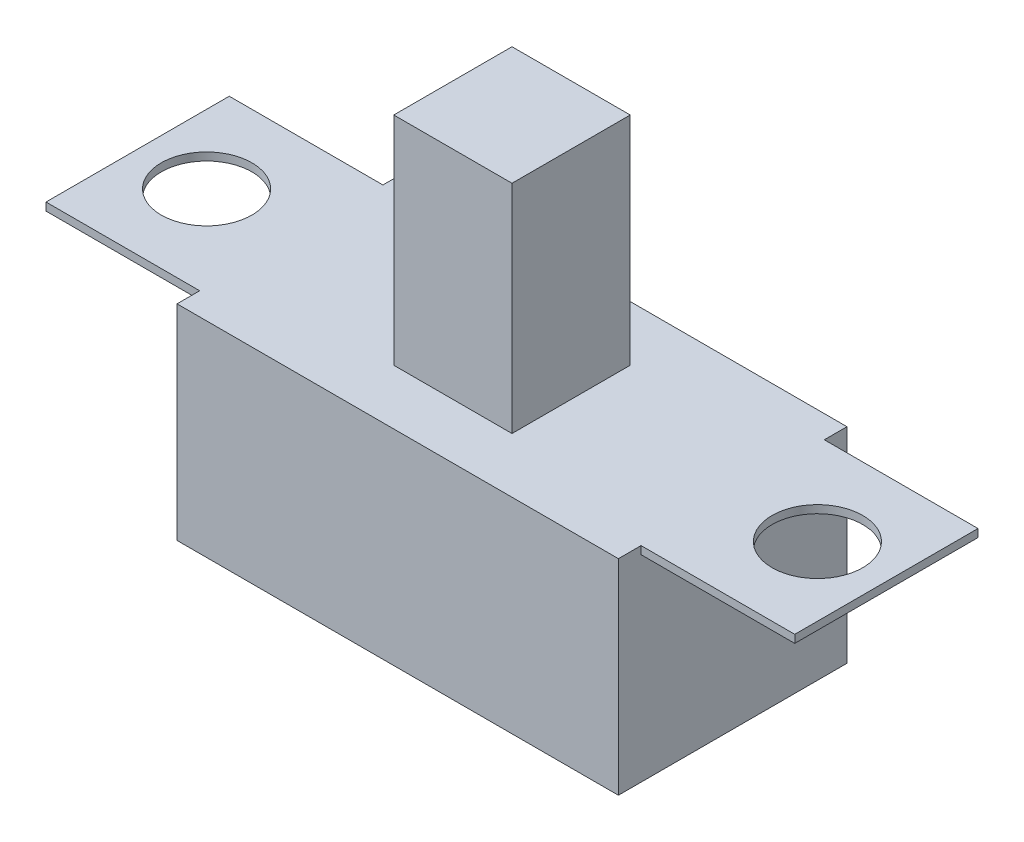
ISO-10303-21;
HEADER;
FILE_DESCRIPTION(('STEP AP214'),'2;1');
FILE_NAME('part.step','',(''),(''),'','','');
FILE_SCHEMA(('AUTOMOTIVE_DESIGN { 1 0 10303 214 1 1 1 1 }'));
ENDSEC;
DATA;
#1=APPLICATION_CONTEXT('core data for automotive mechanical design processes');
#2=APPLICATION_PROTOCOL_DEFINITION('international standard','automotive_design',2000,#1);
#3=PRODUCT_CONTEXT('',#1,'mechanical');
#4=PRODUCT('Part','Part','',(#3));
#5=PRODUCT_RELATED_PRODUCT_CATEGORY('part','',(#4));
#6=PRODUCT_DEFINITION_FORMATION('','',#4);
#7=PRODUCT_DEFINITION_CONTEXT('part definition',#1,'design');
#8=PRODUCT_DEFINITION('design','',#6,#7);
#9=PRODUCT_DEFINITION_SHAPE('','',#8);
#10=(LENGTH_UNIT() NAMED_UNIT(*) SI_UNIT(.MILLI.,.METRE.));
#11=(NAMED_UNIT(*) PLANE_ANGLE_UNIT() SI_UNIT($,.RADIAN.));
#12=(NAMED_UNIT(*) SI_UNIT($,.STERADIAN.) SOLID_ANGLE_UNIT());
#13=UNCERTAINTY_MEASURE_WITH_UNIT(LENGTH_MEASURE(1.E-05),#10,'distance_accuracy_value','');
#14=(GEOMETRIC_REPRESENTATION_CONTEXT(3) GLOBAL_UNCERTAINTY_ASSIGNED_CONTEXT((#13)) GLOBAL_UNIT_ASSIGNED_CONTEXT((#10,
#11,#12)) REPRESENTATION_CONTEXT('',''));
#15=CARTESIAN_POINT('',(0.,0.,0.));
#16=DIRECTION('',(0.,0.,1.));
#17=DIRECTION('',(1.,0.,0.));
#18=AXIS2_PLACEMENT_3D('',#15,#16,#17);
#19=CARTESIAN_POINT('',(0.,0.2,0.));
#20=DIRECTION('',(0.,-1.,0.));
#21=DIRECTION('',(0.,0.,-1.));
#22=AXIS2_PLACEMENT_3D('',#19,#20,#21);
#23=PLANE('',#22);
#24=CARTESIAN_POINT('',(-7.75,0.2,0.));
#25=DIRECTION('',(0.,1.,0.));
#26=DIRECTION('',(0.,0.,1.));
#27=AXIS2_PLACEMENT_3D('',#24,#25,#26);
#28=CIRCLE('',#27,1.15);
#29=CARTESIAN_POINT('',(-7.75,0.2,1.15));
#30=VERTEX_POINT('',#29);
#31=EDGE_CURVE('E189',#30,#30,#28,.T.);
#32=ORIENTED_EDGE('',*,*,#31,.F.);
#33=EDGE_LOOP('',(#32));
#34=FACE_BOUND('',#33,.T.);
#35=CARTESIAN_POINT('',(7.75,0.2,0.));
#36=DIRECTION('',(0.,1.,0.));
#37=DIRECTION('',(0.,0.,1.));
#38=AXIS2_PLACEMENT_3D('',#35,#36,#37);
#39=CIRCLE('',#38,1.15);
#40=CARTESIAN_POINT('',(7.75,0.2,1.15));
#41=VERTEX_POINT('',#40);
#42=EDGE_CURVE('E195',#41,#41,#39,.T.);
#43=ORIENTED_EDGE('',*,*,#42,.F.);
#44=EDGE_LOOP('',(#43));
#45=FACE_BOUND('',#44,.T.);
#46=DIRECTION('',(-1.,0.,0.));
#47=VECTOR('',#46,1.);
#48=CARTESIAN_POINT('',(5.6,0.2,-2.325));
#49=LINE('',#48,#47);
#50=CARTESIAN_POINT('',(9.5,0.2,-2.325));
#51=VERTEX_POINT('',#50);
#52=CARTESIAN_POINT('',(5.6,0.2,-2.325));
#53=VERTEX_POINT('',#52);
#54=EDGE_CURVE('E201',#51,#53,#49,.T.);
#55=ORIENTED_EDGE('',*,*,#54,.T.);
#56=DIRECTION('',(0.,0.,-1.));
#57=VECTOR('',#56,1.);
#58=CARTESIAN_POINT('',(5.6,0.2,-2.9));
#59=LINE('',#58,#57);
#60=CARTESIAN_POINT('',(5.6,0.2,-2.9));
#61=VERTEX_POINT('',#60);
#62=EDGE_CURVE('E204',#53,#61,#59,.T.);
#63=ORIENTED_EDGE('',*,*,#62,.T.);
#64=DIRECTION('',(-1.,0.,0.));
#65=VECTOR('',#64,1.);
#66=CARTESIAN_POINT('',(-5.6,0.2,-2.9));
#67=LINE('',#66,#65);
#68=CARTESIAN_POINT('',(-5.6,0.2,-2.9));
#69=VERTEX_POINT('',#68);
#70=EDGE_CURVE('E207',#61,#69,#67,.T.);
#71=ORIENTED_EDGE('',*,*,#70,.T.);
#72=DIRECTION('',(0.,0.,1.));
#73=VECTOR('',#72,1.);
#74=CARTESIAN_POINT('',(-5.6,0.2,-2.325));
#75=LINE('',#74,#73);
#76=CARTESIAN_POINT('',(-5.6,0.2,-2.325));
#77=VERTEX_POINT('',#76);
#78=EDGE_CURVE('E209',#69,#77,#75,.T.);
#79=ORIENTED_EDGE('',*,*,#78,.T.);
#80=DIRECTION('',(-1.,0.,0.));
#81=VECTOR('',#80,1.);
#82=CARTESIAN_POINT('',(-9.5,0.2,-2.325));
#83=LINE('',#82,#81);
#84=CARTESIAN_POINT('',(-9.5,0.2,-2.325));
#85=VERTEX_POINT('',#84);
#86=EDGE_CURVE('E211',#77,#85,#83,.T.);
#87=ORIENTED_EDGE('',*,*,#86,.T.);
#88=DIRECTION('',(0.,0.,1.));
#89=VECTOR('',#88,1.);
#90=CARTESIAN_POINT('',(-9.5,0.2,2.325));
#91=LINE('',#90,#89);
#92=CARTESIAN_POINT('',(-9.5,0.2,2.325));
#93=VERTEX_POINT('',#92);
#94=EDGE_CURVE('E213',#85,#93,#91,.T.);
#95=ORIENTED_EDGE('',*,*,#94,.T.);
#96=DIRECTION('',(1.,0.,0.));
#97=VECTOR('',#96,1.);
#98=CARTESIAN_POINT('',(-5.6,0.2,2.325));
#99=LINE('',#98,#97);
#100=CARTESIAN_POINT('',(-5.6,0.2,2.325));
#101=VERTEX_POINT('',#100);
#102=EDGE_CURVE('E215',#93,#101,#99,.T.);
#103=ORIENTED_EDGE('',*,*,#102,.T.);
#104=DIRECTION('',(0.,0.,1.));
#105=VECTOR('',#104,1.);
#106=CARTESIAN_POINT('',(-5.6,0.2,2.9));
#107=LINE('',#106,#105);
#108=CARTESIAN_POINT('',(-5.6,0.2,2.9));
#109=VERTEX_POINT('',#108);
#110=EDGE_CURVE('E217',#101,#109,#107,.T.);
#111=ORIENTED_EDGE('',*,*,#110,.T.);
#112=DIRECTION('',(1.,0.,0.));
#113=VECTOR('',#112,1.);
#114=CARTESIAN_POINT('',(5.6,0.2,2.9));
#115=LINE('',#114,#113);
#116=CARTESIAN_POINT('',(5.6,0.2,2.9));
#117=VERTEX_POINT('',#116);
#118=EDGE_CURVE('E219',#109,#117,#115,.T.);
#119=ORIENTED_EDGE('',*,*,#118,.T.);
#120=DIRECTION('',(0.,0.,-1.));
#121=VECTOR('',#120,1.);
#122=CARTESIAN_POINT('',(5.6,0.2,2.325));
#123=LINE('',#122,#121);
#124=CARTESIAN_POINT('',(5.6,0.2,2.325));
#125=VERTEX_POINT('',#124);
#126=EDGE_CURVE('E221',#117,#125,#123,.T.);
#127=ORIENTED_EDGE('',*,*,#126,.T.);
#128=DIRECTION('',(1.,0.,0.));
#129=VECTOR('',#128,1.);
#130=CARTESIAN_POINT('',(9.5,0.2,2.325));
#131=LINE('',#130,#129);
#132=CARTESIAN_POINT('',(9.5,0.2,2.325));
#133=VERTEX_POINT('',#132);
#134=EDGE_CURVE('E223',#125,#133,#131,.T.);
#135=ORIENTED_EDGE('',*,*,#134,.T.);
#136=DIRECTION('',(0.,0.,-1.));
#137=VECTOR('',#136,1.);
#138=CARTESIAN_POINT('',(9.5,0.2,-2.325));
#139=LINE('',#138,#137);
#140=EDGE_CURVE('E225',#133,#51,#139,.T.);
#141=ORIENTED_EDGE('',*,*,#140,.T.);
#142=EDGE_LOOP('',(#55,#63,#71,#79,#87,#95,#103,#111,#119,#127,#135,#141));
#143=FACE_BOUND('',#142,.T.);
#144=DIRECTION('',(0.,0.,-1.));
#145=VECTOR('',#144,1.);
#146=CARTESIAN_POINT('',(1.5,0.2,-1.5));
#147=LINE('',#146,#145);
#148=CARTESIAN_POINT('',(1.5,0.2,1.5));
#149=VERTEX_POINT('',#148);
#150=CARTESIAN_POINT('',(1.5,0.2,-1.5));
#151=VERTEX_POINT('',#150);
#152=EDGE_CURVE('E169',#149,#151,#147,.T.);
#153=ORIENTED_EDGE('',*,*,#152,.F.);
#154=DIRECTION('',(1.,0.,0.));
#155=VECTOR('',#154,1.);
#156=CARTESIAN_POINT('',(-1.5,0.2,1.5));
#157=LINE('',#156,#155);
#158=CARTESIAN_POINT('',(-1.5,0.2,1.5));
#159=VERTEX_POINT('',#158);
#160=EDGE_CURVE('E166',#159,#149,#157,.T.);
#161=ORIENTED_EDGE('',*,*,#160,.F.);
#162=DIRECTION('',(0.,0.,1.));
#163=VECTOR('',#162,1.);
#164=CARTESIAN_POINT('',(-1.5,0.2,-1.5));
#165=LINE('',#164,#163);
#166=CARTESIAN_POINT('',(-1.5,0.2,-1.5));
#167=VERTEX_POINT('',#166);
#168=EDGE_CURVE('E57',#167,#159,#165,.T.);
#169=ORIENTED_EDGE('',*,*,#168,.F.);
#170=DIRECTION('',(-1.,0.,0.));
#171=VECTOR('',#170,1.);
#172=CARTESIAN_POINT('',(-1.5,0.2,-1.5));
#173=LINE('',#172,#171);
#174=EDGE_CURVE('E52',#151,#167,#173,.T.);
#175=ORIENTED_EDGE('',*,*,#174,.F.);
#176=EDGE_LOOP('',(#153,#161,#169,#175));
#177=FACE_BOUND('',#176,.T.);
#178=ADVANCED_FACE('F35',(#34,#45,#143,#177),#23,.F.);
#179=CARTESIAN_POINT('',(0.,0.,0.));
#180=DIRECTION('',(0.,-1.,0.));
#181=DIRECTION('',(0.,0.,-1.));
#182=AXIS2_PLACEMENT_3D('',#179,#180,#181);
#183=PLANE('',#182);
#184=DIRECTION('',(0.,0.,-1.));
#185=VECTOR('',#184,1.);
#186=CARTESIAN_POINT('',(-5.6,0.,2.9));
#187=LINE('',#186,#185);
#188=CARTESIAN_POINT('',(-5.6,0.,2.325));
#189=VERTEX_POINT('',#188);
#190=CARTESIAN_POINT('',(-5.6,0.,-2.325));
#191=VERTEX_POINT('',#190);
#192=EDGE_CURVE('E11',#189,#191,#187,.T.);
#193=ORIENTED_EDGE('',*,*,#192,.F.);
#194=DIRECTION('',(1.,0.,0.));
#195=VECTOR('',#194,1.);
#196=CARTESIAN_POINT('',(-5.6,0.,2.325));
#197=LINE('',#196,#195);
#198=CARTESIAN_POINT('',(-9.5,0.,2.325));
#199=VERTEX_POINT('',#198);
#200=EDGE_CURVE('E234',#199,#189,#197,.T.);
#201=ORIENTED_EDGE('',*,*,#200,.F.);
#202=DIRECTION('',(0.,0.,1.));
#203=VECTOR('',#202,1.);
#204=CARTESIAN_POINT('',(-9.5,0.,2.325));
#205=LINE('',#204,#203);
#206=CARTESIAN_POINT('',(-9.5,0.,-2.325));
#207=VERTEX_POINT('',#206);
#208=EDGE_CURVE('E232',#207,#199,#205,.T.);
#209=ORIENTED_EDGE('',*,*,#208,.F.);
#210=DIRECTION('',(-1.,0.,0.));
#211=VECTOR('',#210,1.);
#212=CARTESIAN_POINT('',(-9.5,0.,-2.325));
#213=LINE('',#212,#211);
#214=EDGE_CURVE('E230',#191,#207,#213,.T.);
#215=ORIENTED_EDGE('',*,*,#214,.F.);
#216=EDGE_LOOP('',(#193,#201,#209,#215));
#217=FACE_BOUND('',#216,.T.);
#218=CARTESIAN_POINT('',(-7.75,0.,0.));
#219=DIRECTION('',(0.,1.,0.));
#220=DIRECTION('',(0.,0.,1.));
#221=AXIS2_PLACEMENT_3D('',#218,#219,#220);
#222=CIRCLE('',#221,1.15);
#223=CARTESIAN_POINT('',(-7.75,0.,1.15));
#224=VERTEX_POINT('',#223);
#225=EDGE_CURVE('E186',#224,#224,#222,.T.);
#226=ORIENTED_EDGE('',*,*,#225,.T.);
#227=EDGE_LOOP('',(#226));
#228=FACE_BOUND('',#227,.T.);
#229=ADVANCED_FACE('F320',(#217,#228),#183,.T.);
#230=DIRECTION('',(0.,0.,1.));
#231=VECTOR('',#230,1.);
#232=CARTESIAN_POINT('',(5.6,0.,2.9));
#233=LINE('',#232,#231);
#234=CARTESIAN_POINT('',(5.6,0.,-2.325));
#235=VERTEX_POINT('',#234);
#236=CARTESIAN_POINT('',(5.6,0.,2.325));
#237=VERTEX_POINT('',#236);
#238=EDGE_CURVE('E44',#235,#237,#233,.T.);
#239=ORIENTED_EDGE('',*,*,#238,.F.);
#240=DIRECTION('',(-1.,0.,0.));
#241=VECTOR('',#240,1.);
#242=CARTESIAN_POINT('',(5.6,0.,-2.325));
#243=LINE('',#242,#241);
#244=CARTESIAN_POINT('',(9.5,0.,-2.325));
#245=VERTEX_POINT('',#244);
#246=EDGE_CURVE('E198',#245,#235,#243,.T.);
#247=ORIENTED_EDGE('',*,*,#246,.F.);
#248=DIRECTION('',(0.,0.,-1.));
#249=VECTOR('',#248,1.);
#250=CARTESIAN_POINT('',(9.5,0.,-2.325));
#251=LINE('',#250,#249);
#252=CARTESIAN_POINT('',(9.5,0.,2.325));
#253=VERTEX_POINT('',#252);
#254=EDGE_CURVE('E205',#253,#245,#251,.T.);
#255=ORIENTED_EDGE('',*,*,#254,.F.);
#256=DIRECTION('',(1.,0.,0.));
#257=VECTOR('',#256,1.);
#258=CARTESIAN_POINT('',(9.5,0.,2.325));
#259=LINE('',#258,#257);
#260=EDGE_CURVE('E237',#237,#253,#259,.T.);
#261=ORIENTED_EDGE('',*,*,#260,.F.);
#262=EDGE_LOOP('',(#239,#247,#255,#261));
#263=FACE_BOUND('',#262,.T.);
#264=CARTESIAN_POINT('',(7.75,0.,0.));
#265=DIRECTION('',(0.,1.,0.));
#266=DIRECTION('',(0.,0.,1.));
#267=AXIS2_PLACEMENT_3D('',#264,#265,#266);
#268=CIRCLE('',#267,1.15);
#269=CARTESIAN_POINT('',(7.75,0.,1.15));
#270=VERTEX_POINT('',#269);
#271=EDGE_CURVE('E192',#270,#270,#268,.T.);
#272=ORIENTED_EDGE('',*,*,#271,.T.);
#273=EDGE_LOOP('',(#272));
#274=FACE_BOUND('',#273,.T.);
#275=ADVANCED_FACE('F281',(#263,#274),#183,.T.);
#276=CARTESIAN_POINT('',(5.6,0.2,-2.325));
#277=DIRECTION('',(0.,0.,1.));
#278=DIRECTION('',(1.,0.,0.));
#279=AXIS2_PLACEMENT_3D('',#276,#277,#278);
#280=PLANE('',#279);
#281=ORIENTED_EDGE('',*,*,#246,.T.);
#282=DIRECTION('',(0.,-1.,0.));
#283=VECTOR('',#282,1.);
#284=CARTESIAN_POINT('',(5.6,0.2,-2.325));
#285=LINE('',#284,#283);
#286=EDGE_CURVE('E39',#53,#235,#285,.T.);
#287=ORIENTED_EDGE('',*,*,#286,.F.);
#288=ORIENTED_EDGE('',*,*,#54,.F.);
#289=DIRECTION('',(0.,-1.,0.));
#290=VECTOR('',#289,1.);
#291=CARTESIAN_POINT('',(9.5,0.2,-2.325));
#292=LINE('',#291,#290);
#293=EDGE_CURVE('E227',#51,#245,#292,.T.);
#294=ORIENTED_EDGE('',*,*,#293,.T.);
#295=EDGE_LOOP('',(#281,#287,#288,#294));
#296=FACE_BOUND('',#295,.T.);
#297=ADVANCED_FACE('F37',(#296),#280,.F.);
#298=CARTESIAN_POINT('',(-5.6,0.2,-2.9));
#299=DIRECTION('',(0.,0.,1.));
#300=DIRECTION('',(1.,0.,0.));
#301=AXIS2_PLACEMENT_3D('',#298,#299,#300);
#302=PLANE('',#301);
#303=DIRECTION('',(0.,-1.,0.));
#304=VECTOR('',#303,1.);
#305=CARTESIAN_POINT('',(5.6,0.2,-2.9));
#306=LINE('',#305,#304);
#307=CARTESIAN_POINT('',(5.6,-5.,-2.9));
#308=VERTEX_POINT('',#307);
#309=EDGE_CURVE('E265',#61,#308,#306,.T.);
#310=ORIENTED_EDGE('',*,*,#309,.T.);
#311=DIRECTION('',(1.,0.,0.));
#312=VECTOR('',#311,1.);
#313=CARTESIAN_POINT('',(-5.6,-5.,-2.9));
#314=LINE('',#313,#312);
#315=CARTESIAN_POINT('',(-5.6,-5.,-2.9));
#316=VERTEX_POINT('',#315);
#317=EDGE_CURVE('E173',#316,#308,#314,.T.);
#318=ORIENTED_EDGE('',*,*,#317,.F.);
#319=DIRECTION('',(0.,-1.,0.));
#320=VECTOR('',#319,1.);
#321=CARTESIAN_POINT('',(-5.6,0.2,-2.9));
#322=LINE('',#321,#320);
#323=EDGE_CURVE('E264',#69,#316,#322,.T.);
#324=ORIENTED_EDGE('',*,*,#323,.F.);
#325=ORIENTED_EDGE('',*,*,#70,.F.);
#326=EDGE_LOOP('',(#310,#318,#324,#325));
#327=FACE_BOUND('',#326,.T.);
#328=ADVANCED_FACE('F309',(#327),#302,.F.);
#329=CARTESIAN_POINT('',(-9.5,0.2,-2.325));
#330=DIRECTION('',(0.,0.,1.));
#331=DIRECTION('',(1.,0.,0.));
#332=AXIS2_PLACEMENT_3D('',#329,#330,#331);
#333=PLANE('',#332);
#334=ORIENTED_EDGE('',*,*,#214,.T.);
#335=DIRECTION('',(0.,-1.,0.));
#336=VECTOR('',#335,1.);
#337=CARTESIAN_POINT('',(-9.5,0.2,-2.325));
#338=LINE('',#337,#336);
#339=EDGE_CURVE('E258',#85,#207,#338,.T.);
#340=ORIENTED_EDGE('',*,*,#339,.F.);
#341=ORIENTED_EDGE('',*,*,#86,.F.);
#342=DIRECTION('',(0.,-1.,0.));
#343=VECTOR('',#342,1.);
#344=CARTESIAN_POINT('',(-5.6,0.2,-2.325));
#345=LINE('',#344,#343);
#346=EDGE_CURVE('E261',#77,#191,#345,.T.);
#347=ORIENTED_EDGE('',*,*,#346,.T.);
#348=EDGE_LOOP('',(#334,#340,#341,#347));
#349=FACE_BOUND('',#348,.T.);
#350=ADVANCED_FACE('F311',(#349),#333,.F.);
#351=CARTESIAN_POINT('',(-9.5,0.2,2.325));
#352=DIRECTION('',(1.,0.,0.));
#353=DIRECTION('',(0.,0.,-1.));
#354=AXIS2_PLACEMENT_3D('',#351,#352,#353);
#355=PLANE('',#354);
#356=ORIENTED_EDGE('',*,*,#208,.T.);
#357=DIRECTION('',(0.,-1.,0.));
#358=VECTOR('',#357,1.);
#359=CARTESIAN_POINT('',(-9.5,0.2,2.325));
#360=LINE('',#359,#358);
#361=EDGE_CURVE('E255',#93,#199,#360,.T.);
#362=ORIENTED_EDGE('',*,*,#361,.F.);
#363=ORIENTED_EDGE('',*,*,#94,.F.);
#364=ORIENTED_EDGE('',*,*,#339,.T.);
#365=EDGE_LOOP('',(#356,#362,#363,#364));
#366=FACE_BOUND('',#365,.T.);
#367=ADVANCED_FACE('F316',(#366),#355,.F.);
#368=CARTESIAN_POINT('',(-5.6,0.2,2.325));
#369=DIRECTION('',(0.,0.,-1.));
#370=DIRECTION('',(-1.,0.,0.));
#371=AXIS2_PLACEMENT_3D('',#368,#369,#370);
#372=PLANE('',#371);
#373=ORIENTED_EDGE('',*,*,#200,.T.);
#374=DIRECTION('',(0.,-1.,0.));
#375=VECTOR('',#374,1.);
#376=CARTESIAN_POINT('',(-5.6,0.2,2.325));
#377=LINE('',#376,#375);
#378=EDGE_CURVE('E252',#101,#189,#377,.T.);
#379=ORIENTED_EDGE('',*,*,#378,.F.);
#380=ORIENTED_EDGE('',*,*,#102,.F.);
#381=ORIENTED_EDGE('',*,*,#361,.T.);
#382=EDGE_LOOP('',(#373,#379,#380,#381));
#383=FACE_BOUND('',#382,.T.);
#384=ADVANCED_FACE('F345',(#383),#372,.F.);
#385=CARTESIAN_POINT('',(-5.6,0.2,2.9));
#386=DIRECTION('',(1.,0.,0.));
#387=DIRECTION('',(0.,0.,-1.));
#388=AXIS2_PLACEMENT_3D('',#385,#386,#387);
#389=PLANE('',#388);
#390=ORIENTED_EDGE('',*,*,#378,.T.);
#391=ORIENTED_EDGE('',*,*,#192,.T.);
#392=ORIENTED_EDGE('',*,*,#346,.F.);
#393=ORIENTED_EDGE('',*,*,#78,.F.);
#394=ORIENTED_EDGE('',*,*,#323,.T.);
#395=DIRECTION('',(0.,0.,-1.));
#396=VECTOR('',#395,1.);
#397=CARTESIAN_POINT('',(-5.6,-5.,2.9));
#398=LINE('',#397,#396);
#399=CARTESIAN_POINT('',(-5.6,-5.,2.9));
#400=VERTEX_POINT('',#399);
#401=EDGE_CURVE('E170',#400,#316,#398,.T.);
#402=ORIENTED_EDGE('',*,*,#401,.F.);
#403=DIRECTION('',(0.,-1.,0.));
#404=VECTOR('',#403,1.);
#405=CARTESIAN_POINT('',(-5.6,0.2,2.9));
#406=LINE('',#405,#404);
#407=EDGE_CURVE('E250',#109,#400,#406,.T.);
#408=ORIENTED_EDGE('',*,*,#407,.F.);
#409=ORIENTED_EDGE('',*,*,#110,.F.);
#410=EDGE_LOOP('',(#390,#391,#392,#393,#394,#402,#408,#409));
#411=FACE_BOUND('',#410,.T.);
#412=ADVANCED_FACE('F305',(#411),#389,.F.);
#413=CARTESIAN_POINT('',(5.6,0.2,2.9));
#414=DIRECTION('',(0.,0.,-1.));
#415=DIRECTION('',(-1.,0.,0.));
#416=AXIS2_PLACEMENT_3D('',#413,#414,#415);
#417=PLANE('',#416);
#418=ORIENTED_EDGE('',*,*,#407,.T.);
#419=DIRECTION('',(-1.,0.,0.));
#420=VECTOR('',#419,1.);
#421=CARTESIAN_POINT('',(-5.6,-5.,2.9));
#422=LINE('',#421,#420);
#423=CARTESIAN_POINT('',(5.6,-5.,2.9));
#424=VERTEX_POINT('',#423);
#425=EDGE_CURVE('E184',#424,#400,#422,.T.);
#426=ORIENTED_EDGE('',*,*,#425,.F.);
#427=DIRECTION('',(0.,-1.,0.));
#428=VECTOR('',#427,1.);
#429=CARTESIAN_POINT('',(5.6,0.2,2.9));
#430=LINE('',#429,#428);
#431=EDGE_CURVE('E248',#117,#424,#430,.T.);
#432=ORIENTED_EDGE('',*,*,#431,.F.);
#433=ORIENTED_EDGE('',*,*,#118,.F.);
#434=EDGE_LOOP('',(#418,#426,#432,#433));
#435=FACE_BOUND('',#434,.T.);
#436=ADVANCED_FACE('F301',(#435),#417,.F.);
#437=CARTESIAN_POINT('',(5.6,0.2,2.325));
#438=DIRECTION('',(-1.,0.,0.));
#439=DIRECTION('',(0.,0.,1.));
#440=AXIS2_PLACEMENT_3D('',#437,#438,#439);
#441=PLANE('',#440);
#442=ORIENTED_EDGE('',*,*,#431,.T.);
#443=DIRECTION('',(0.,0.,1.));
#444=VECTOR('',#443,1.);
#445=CARTESIAN_POINT('',(5.6,-5.,2.9));
#446=LINE('',#445,#444);
#447=EDGE_CURVE('E181',#308,#424,#446,.T.);
#448=ORIENTED_EDGE('',*,*,#447,.F.);
#449=ORIENTED_EDGE('',*,*,#309,.F.);
#450=ORIENTED_EDGE('',*,*,#62,.F.);
#451=ORIENTED_EDGE('',*,*,#286,.T.);
#452=ORIENTED_EDGE('',*,*,#238,.T.);
#453=DIRECTION('',(0.,-1.,0.));
#454=VECTOR('',#453,1.);
#455=CARTESIAN_POINT('',(5.6,0.2,2.325));
#456=LINE('',#455,#454);
#457=EDGE_CURVE('E245',#125,#237,#456,.T.);
#458=ORIENTED_EDGE('',*,*,#457,.F.);
#459=ORIENTED_EDGE('',*,*,#126,.F.);
#460=EDGE_LOOP('',(#442,#448,#449,#450,#451,#452,#458,#459));
#461=FACE_BOUND('',#460,.T.);
#462=ADVANCED_FACE('F273',(#461),#441,.F.);
#463=CARTESIAN_POINT('',(9.5,0.2,2.325));
#464=DIRECTION('',(0.,0.,-1.));
#465=DIRECTION('',(-1.,0.,0.));
#466=AXIS2_PLACEMENT_3D('',#463,#464,#465);
#467=PLANE('',#466);
#468=ORIENTED_EDGE('',*,*,#260,.T.);
#469=DIRECTION('',(0.,-1.,0.));
#470=VECTOR('',#469,1.);
#471=CARTESIAN_POINT('',(9.5,0.2,2.325));
#472=LINE('',#471,#470);
#473=EDGE_CURVE('E242',#133,#253,#472,.T.);
#474=ORIENTED_EDGE('',*,*,#473,.F.);
#475=ORIENTED_EDGE('',*,*,#134,.F.);
#476=ORIENTED_EDGE('',*,*,#457,.T.);
#477=EDGE_LOOP('',(#468,#474,#475,#476));
#478=FACE_BOUND('',#477,.T.);
#479=ADVANCED_FACE('F286',(#478),#467,.F.);
#480=CARTESIAN_POINT('',(9.5,0.2,-2.325));
#481=DIRECTION('',(-1.,0.,0.));
#482=DIRECTION('',(0.,0.,1.));
#483=AXIS2_PLACEMENT_3D('',#480,#481,#482);
#484=PLANE('',#483);
#485=ORIENTED_EDGE('',*,*,#254,.T.);
#486=ORIENTED_EDGE('',*,*,#293,.F.);
#487=ORIENTED_EDGE('',*,*,#140,.F.);
#488=ORIENTED_EDGE('',*,*,#473,.T.);
#489=EDGE_LOOP('',(#485,#486,#487,#488));
#490=FACE_BOUND('',#489,.T.);
#491=ADVANCED_FACE('F290',(#490),#484,.F.);
#492=CARTESIAN_POINT('',(7.75,0.2,0.));
#493=DIRECTION('',(0.,-1.,0.));
#494=DIRECTION('',(0.,0.,-1.));
#495=AXIS2_PLACEMENT_3D('',#492,#493,#494);
#496=CYLINDRICAL_SURFACE('',#495,1.15);
#497=ORIENTED_EDGE('',*,*,#42,.T.);
#498=EDGE_LOOP('',(#497));
#499=FACE_BOUND('',#498,.T.);
#500=ORIENTED_EDGE('',*,*,#271,.F.);
#501=EDGE_LOOP('',(#500));
#502=FACE_BOUND('',#501,.T.);
#503=ADVANCED_FACE('F331',(#499,#502),#496,.F.);
#504=CARTESIAN_POINT('',(-7.75,0.2,0.));
#505=DIRECTION('',(0.,-1.,0.));
#506=DIRECTION('',(0.,0.,-1.));
#507=AXIS2_PLACEMENT_3D('',#504,#505,#506);
#508=CYLINDRICAL_SURFACE('',#507,1.15);
#509=ORIENTED_EDGE('',*,*,#31,.T.);
#510=EDGE_LOOP('',(#509));
#511=FACE_BOUND('',#510,.T.);
#512=ORIENTED_EDGE('',*,*,#225,.F.);
#513=EDGE_LOOP('',(#512));
#514=FACE_BOUND('',#513,.T.);
#515=ADVANCED_FACE('F365',(#511,#514),#508,.F.);
#516=CARTESIAN_POINT('',(0.,-5.,0.));
#517=DIRECTION('',(0.,-1.,0.));
#518=DIRECTION('',(0.,0.,-1.));
#519=AXIS2_PLACEMENT_3D('',#516,#517,#518);
#520=PLANE('',#519);
#521=ORIENTED_EDGE('',*,*,#401,.T.);
#522=ORIENTED_EDGE('',*,*,#317,.T.);
#523=ORIENTED_EDGE('',*,*,#447,.T.);
#524=ORIENTED_EDGE('',*,*,#425,.T.);
#525=EDGE_LOOP('',(#521,#522,#523,#524));
#526=FACE_BOUND('',#525,.T.);
#527=ADVANCED_FACE('F299',(#526),#520,.T.);
#528=CARTESIAN_POINT('',(1.5,5.7,-1.5));
#529=DIRECTION('',(-1.,0.,0.));
#530=DIRECTION('',(0.,0.,1.));
#531=AXIS2_PLACEMENT_3D('',#528,#529,#530);
#532=PLANE('',#531);
#533=ORIENTED_EDGE('',*,*,#152,.T.);
#534=DIRECTION('',(0.,-1.,0.));
#535=VECTOR('',#534,1.);
#536=CARTESIAN_POINT('',(1.5,5.7,-1.5));
#537=LINE('',#536,#535);
#538=CARTESIAN_POINT('',(1.5,5.7,-1.5));
#539=VERTEX_POINT('',#538);
#540=EDGE_CURVE('E150',#539,#151,#537,.T.);
#541=ORIENTED_EDGE('',*,*,#540,.F.);
#542=DIRECTION('',(0.,0.,-1.));
#543=VECTOR('',#542,1.);
#544=CARTESIAN_POINT('',(1.5,5.7,-1.5));
#545=LINE('',#544,#543);
#546=CARTESIAN_POINT('',(1.5,5.7,1.5));
#547=VERTEX_POINT('',#546);
#548=EDGE_CURVE('E157',#547,#539,#545,.T.);
#549=ORIENTED_EDGE('',*,*,#548,.F.);
#550=DIRECTION('',(0.,-1.,0.));
#551=VECTOR('',#550,1.);
#552=CARTESIAN_POINT('',(1.5,5.7,1.5));
#553=LINE('',#552,#551);
#554=EDGE_CURVE('E526',#547,#149,#553,.T.);
#555=ORIENTED_EDGE('',*,*,#554,.T.);
#556=EDGE_LOOP('',(#533,#541,#549,#555));
#557=FACE_BOUND('',#556,.T.);
#558=ADVANCED_FACE('F168',(#557),#532,.F.);
#559=CARTESIAN_POINT('',(-1.5,5.7,-1.5));
#560=DIRECTION('',(0.,0.,1.));
#561=DIRECTION('',(1.,0.,0.));
#562=AXIS2_PLACEMENT_3D('',#559,#560,#561);
#563=PLANE('',#562);
#564=ORIENTED_EDGE('',*,*,#174,.T.);
#565=DIRECTION('',(0.,-1.,0.));
#566=VECTOR('',#565,1.);
#567=CARTESIAN_POINT('',(-1.5,5.7,-1.5));
#568=LINE('',#567,#566);
#569=CARTESIAN_POINT('',(-1.5,5.7,-1.5));
#570=VERTEX_POINT('',#569);
#571=EDGE_CURVE('E153',#570,#167,#568,.T.);
#572=ORIENTED_EDGE('',*,*,#571,.F.);
#573=DIRECTION('',(-1.,0.,0.));
#574=VECTOR('',#573,1.);
#575=CARTESIAN_POINT('',(-1.5,5.7,-1.5));
#576=LINE('',#575,#574);
#577=EDGE_CURVE('E146',#539,#570,#576,.T.);
#578=ORIENTED_EDGE('',*,*,#577,.F.);
#579=ORIENTED_EDGE('',*,*,#540,.T.);
#580=EDGE_LOOP('',(#564,#572,#578,#579));
#581=FACE_BOUND('',#580,.T.);
#582=ADVANCED_FACE('F148',(#581),#563,.F.);
#583=CARTESIAN_POINT('',(-1.5,5.7,-1.5));
#584=DIRECTION('',(1.,0.,0.));
#585=DIRECTION('',(0.,0.,-1.));
#586=AXIS2_PLACEMENT_3D('',#583,#584,#585);
#587=PLANE('',#586);
#588=ORIENTED_EDGE('',*,*,#168,.T.);
#589=DIRECTION('',(0.,-1.,0.));
#590=VECTOR('',#589,1.);
#591=CARTESIAN_POINT('',(-1.5,5.7,1.5));
#592=LINE('',#591,#590);
#593=CARTESIAN_POINT('',(-1.5,5.7,1.5));
#594=VERTEX_POINT('',#593);
#595=EDGE_CURVE('E175',#594,#159,#592,.T.);
#596=ORIENTED_EDGE('',*,*,#595,.F.);
#597=DIRECTION('',(0.,0.,1.));
#598=VECTOR('',#597,1.);
#599=CARTESIAN_POINT('',(-1.5,5.7,-1.5));
#600=LINE('',#599,#598);
#601=EDGE_CURVE('E156',#570,#594,#600,.T.);
#602=ORIENTED_EDGE('',*,*,#601,.F.);
#603=ORIENTED_EDGE('',*,*,#571,.T.);
#604=EDGE_LOOP('',(#588,#596,#602,#603));
#605=FACE_BOUND('',#604,.T.);
#606=ADVANCED_FACE('F379',(#605),#587,.F.);
#607=CARTESIAN_POINT('',(-1.5,5.7,1.5));
#608=DIRECTION('',(0.,0.,-1.));
#609=DIRECTION('',(-1.,0.,0.));
#610=AXIS2_PLACEMENT_3D('',#607,#608,#609);
#611=PLANE('',#610);
#612=ORIENTED_EDGE('',*,*,#160,.T.);
#613=ORIENTED_EDGE('',*,*,#554,.F.);
#614=DIRECTION('',(1.,0.,0.));
#615=VECTOR('',#614,1.);
#616=CARTESIAN_POINT('',(-1.5,5.7,1.5));
#617=LINE('',#616,#615);
#618=EDGE_CURVE('E162',#594,#547,#617,.T.);
#619=ORIENTED_EDGE('',*,*,#618,.F.);
#620=ORIENTED_EDGE('',*,*,#595,.T.);
#621=EDGE_LOOP('',(#612,#613,#619,#620));
#622=FACE_BOUND('',#621,.T.);
#623=ADVANCED_FACE('F382',(#622),#611,.F.);
#624=CARTESIAN_POINT('',(0.,5.7,0.));
#625=DIRECTION('',(0.,1.,0.));
#626=DIRECTION('',(0.,0.,1.));
#627=AXIS2_PLACEMENT_3D('',#624,#625,#626);
#628=PLANE('',#627);
#629=ORIENTED_EDGE('',*,*,#548,.T.);
#630=ORIENTED_EDGE('',*,*,#577,.T.);
#631=ORIENTED_EDGE('',*,*,#601,.T.);
#632=ORIENTED_EDGE('',*,*,#618,.T.);
#633=EDGE_LOOP('',(#629,#630,#631,#632));
#634=FACE_BOUND('',#633,.T.);
#635=ADVANCED_FACE('F160',(#634),#628,.T.);
#636=CLOSED_SHELL('',(#178,#229,#275,#297,#328,#350,#367,#384,#412,#436,#462,#479,#491,#503,
#515,#527,#558,#582,#606,#623,#635));
#637=MANIFOLD_SOLID_BREP('B2',#636);
#638=ADVANCED_BREP_SHAPE_REPRESENTATION('',(#18,#637),#14);
#639=SHAPE_DEFINITION_REPRESENTATION(#9,#638);
ENDSEC;
END-ISO-10303-21;
